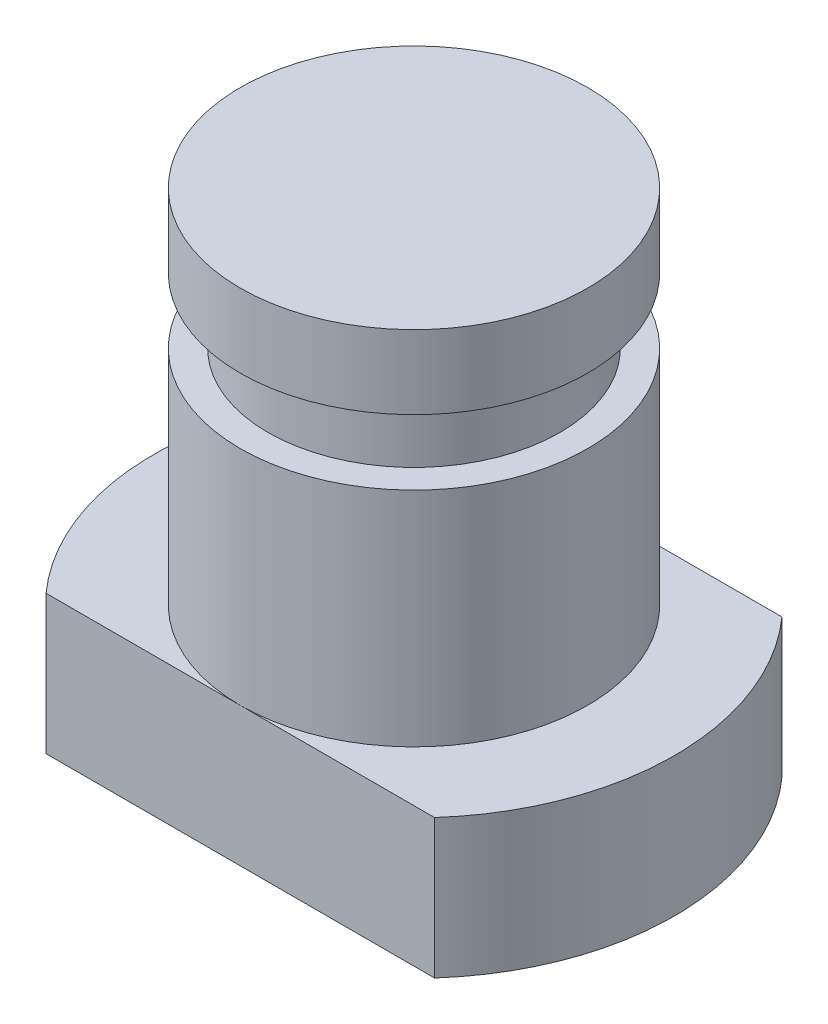
ISO-10303-21;
HEADER;
FILE_DESCRIPTION(('STEP AP214'),'2;1');
FILE_NAME('part.step','',(''),(''),'','','');
FILE_SCHEMA(('AUTOMOTIVE_DESIGN { 1 0 10303 214 1 1 1 1 }'));
ENDSEC;
DATA;
#1=APPLICATION_CONTEXT('core data for automotive mechanical design processes');
#2=APPLICATION_PROTOCOL_DEFINITION('international standard','automotive_design',2000,#1);
#3=PRODUCT_CONTEXT('',#1,'mechanical');
#4=PRODUCT('Part','Part','',(#3));
#5=PRODUCT_RELATED_PRODUCT_CATEGORY('part','',(#4));
#6=PRODUCT_DEFINITION_FORMATION('','',#4);
#7=PRODUCT_DEFINITION_CONTEXT('part definition',#1,'design');
#8=PRODUCT_DEFINITION('design','',#6,#7);
#9=PRODUCT_DEFINITION_SHAPE('','',#8);
#10=(LENGTH_UNIT() NAMED_UNIT(*) SI_UNIT(.MILLI.,.METRE.));
#11=(NAMED_UNIT(*) PLANE_ANGLE_UNIT() SI_UNIT($,.RADIAN.));
#12=(NAMED_UNIT(*) SI_UNIT($,.STERADIAN.) SOLID_ANGLE_UNIT());
#13=UNCERTAINTY_MEASURE_WITH_UNIT(LENGTH_MEASURE(1.E-05),#10,'distance_accuracy_value','');
#14=(GEOMETRIC_REPRESENTATION_CONTEXT(3) GLOBAL_UNCERTAINTY_ASSIGNED_CONTEXT((#13)) GLOBAL_UNIT_ASSIGNED_CONTEXT((#10,
#11,#12)) REPRESENTATION_CONTEXT('',''));
#15=CARTESIAN_POINT('',(0.,0.,0.));
#16=DIRECTION('',(0.,0.,1.));
#17=DIRECTION('',(1.,0.,0.));
#18=AXIS2_PLACEMENT_3D('',#15,#16,#17);
#19=CARTESIAN_POINT('',(0.,6.604,0.));
#20=DIRECTION('',(0.,-1.,0.));
#21=DIRECTION('',(0.,0.,-1.));
#22=AXIS2_PLACEMENT_3D('',#19,#20,#21);
#23=CYLINDRICAL_SURFACE('',#22,3.175);
#24=CARTESIAN_POINT('',(0.,0.,0.));
#25=DIRECTION('',(0.,1.,0.));
#26=DIRECTION('',(0.,0.,1.));
#27=AXIS2_PLACEMENT_3D('',#24,#25,#26);
#28=CIRCLE('',#27,3.175);
#29=CARTESIAN_POINT('',(0.,0.,3.175));
#30=VERTEX_POINT('',#29);
#31=CARTESIAN_POINT('',(0.,0.,-3.175));
#32=VERTEX_POINT('',#31);
#33=EDGE_CURVE('E82',#30,#32,#28,.T.);
#34=ORIENTED_EDGE('',*,*,#33,.T.);
#35=EDGE_CURVE('E95',#32,#30,#28,.T.);
#36=ORIENTED_EDGE('',*,*,#35,.T.);
#37=EDGE_LOOP('',(#34,#36));
#38=FACE_BOUND('',#37,.T.);
#39=CARTESIAN_POINT('',(0.,4.064,0.));
#40=DIRECTION('',(0.,1.,0.));
#41=DIRECTION('',(0.,0.,1.));
#42=AXIS2_PLACEMENT_3D('',#39,#40,#41);
#43=CIRCLE('',#42,3.175);
#44=CARTESIAN_POINT('',(0.,4.064,3.175));
#45=VERTEX_POINT('',#44);
#46=EDGE_CURVE('E160',#45,#45,#43,.T.);
#47=ORIENTED_EDGE('',*,*,#46,.F.);
#48=EDGE_LOOP('',(#47));
#49=FACE_BOUND('',#48,.T.);
#50=ADVANCED_FACE('F73',(#38,#49),#23,.T.);
#51=CARTESIAN_POINT('',(0.,0.,0.));
#52=DIRECTION('',(0.,-1.,0.));
#53=DIRECTION('',(0.,0.,-1.));
#54=AXIS2_PLACEMENT_3D('',#51,#52,#53);
#55=PLANE('',#54);
#56=ORIENTED_EDGE('',*,*,#33,.F.);
#57=DIRECTION('',(1.,0.,0.));
#58=VECTOR('',#57,1.);
#59=CARTESIAN_POINT('',(0.,0.,3.175));
#60=LINE('',#59,#58);
#61=CARTESIAN_POINT('',(3.54975791428092,0.,3.175));
#62=VERTEX_POINT('',#61);
#63=EDGE_CURVE('E178',#30,#62,#60,.T.);
#64=ORIENTED_EDGE('',*,*,#63,.T.);
#65=CARTESIAN_POINT('',(0.,0.,0.));
#66=DIRECTION('',(0.,-1.,0.));
#67=DIRECTION('',(0.,0.,-1.));
#68=AXIS2_PLACEMENT_3D('',#65,#66,#67);
#69=CIRCLE('',#68,4.7625);
#70=CARTESIAN_POINT('',(3.54975791428092,0.,-3.175));
#71=VERTEX_POINT('',#70);
#72=EDGE_CURVE('E177',#71,#62,#69,.T.);
#73=ORIENTED_EDGE('',*,*,#72,.F.);
#74=DIRECTION('',(1.,0.,0.));
#75=VECTOR('',#74,1.);
#76=CARTESIAN_POINT('',(0.,0.,-3.175));
#77=LINE('',#76,#75);
#78=EDGE_CURVE('E144',#32,#71,#77,.T.);
#79=ORIENTED_EDGE('',*,*,#78,.F.);
#80=EDGE_LOOP('',(#56,#64,#73,#79));
#81=FACE_BOUND('',#80,.T.);
#82=ADVANCED_FACE('F181',(#81),#55,.F.);
#83=CARTESIAN_POINT('',(0.,-2.54,3.175));
#84=DIRECTION('',(0.,0.,1.));
#85=DIRECTION('',(1.,0.,0.));
#86=AXIS2_PLACEMENT_3D('',#83,#84,#85);
#87=PLANE('',#86);
#88=CARTESIAN_POINT('',(-3.54975791428092,0.,3.175));
#89=VERTEX_POINT('',#88);
#90=EDGE_CURVE('E90',#89,#30,#60,.T.);
#91=ORIENTED_EDGE('',*,*,#90,.F.);
#92=DIRECTION('',(0.,1.,0.));
#93=VECTOR('',#92,1.);
#94=CARTESIAN_POINT('',(-3.54975791428092,-2.54,3.175));
#95=LINE('',#94,#93);
#96=CARTESIAN_POINT('',(-3.54975791428092,-2.54,3.175));
#97=VERTEX_POINT('',#96);
#98=EDGE_CURVE('E152',#97,#89,#95,.T.);
#99=ORIENTED_EDGE('',*,*,#98,.F.);
#100=DIRECTION('',(1.,0.,0.));
#101=VECTOR('',#100,1.);
#102=CARTESIAN_POINT('',(0.,-2.54,3.175));
#103=LINE('',#102,#101);
#104=CARTESIAN_POINT('',(3.54975791428092,-2.54,3.175));
#105=VERTEX_POINT('',#104);
#106=EDGE_CURVE('E131',#97,#105,#103,.T.);
#107=ORIENTED_EDGE('',*,*,#106,.T.);
#108=DIRECTION('',(0.,1.,0.));
#109=VECTOR('',#108,1.);
#110=CARTESIAN_POINT('',(3.54975791428092,-2.54,3.175));
#111=LINE('',#110,#109);
#112=EDGE_CURVE('E128',#105,#62,#111,.T.);
#113=ORIENTED_EDGE('',*,*,#112,.T.);
#114=ORIENTED_EDGE('',*,*,#63,.F.);
#115=EDGE_LOOP('',(#91,#99,#107,#113,#114));
#116=FACE_BOUND('',#115,.T.);
#117=ADVANCED_FACE('F183',(#116),#87,.T.);
#118=ORIENTED_EDGE('',*,*,#35,.F.);
#119=CARTESIAN_POINT('',(-3.54975791428092,0.,-3.175));
#120=VERTEX_POINT('',#119);
#121=EDGE_CURVE('E175',#120,#32,#77,.T.);
#122=ORIENTED_EDGE('',*,*,#121,.F.);
#123=CARTESIAN_POINT('',(0.,0.,0.));
#124=DIRECTION('',(0.,-1.,0.));
#125=DIRECTION('',(0.,0.,-1.));
#126=AXIS2_PLACEMENT_3D('',#123,#124,#125);
#127=CIRCLE('',#126,4.7625);
#128=EDGE_CURVE('E153',#89,#120,#127,.T.);
#129=ORIENTED_EDGE('',*,*,#128,.F.);
#130=ORIENTED_EDGE('',*,*,#90,.T.);
#131=EDGE_LOOP('',(#118,#122,#129,#130));
#132=FACE_BOUND('',#131,.T.);
#133=ADVANCED_FACE('F194',(#132),#55,.F.);
#134=CARTESIAN_POINT('',(0.,-2.54,0.));
#135=DIRECTION('',(0.,1.,0.));
#136=DIRECTION('',(0.,0.,1.));
#137=AXIS2_PLACEMENT_3D('',#134,#135,#136);
#138=CYLINDRICAL_SURFACE('',#137,4.7625);
#139=ORIENTED_EDGE('',*,*,#72,.T.);
#140=ORIENTED_EDGE('',*,*,#112,.F.);
#141=CARTESIAN_POINT('',(0.,-2.54,0.));
#142=DIRECTION('',(0.,-1.,0.));
#143=DIRECTION('',(0.,0.,-1.));
#144=AXIS2_PLACEMENT_3D('',#141,#142,#143);
#145=CIRCLE('',#144,4.7625);
#146=CARTESIAN_POINT('',(3.54975791428092,-2.54,-3.175));
#147=VERTEX_POINT('',#146);
#148=EDGE_CURVE('E121',#147,#105,#145,.T.);
#149=ORIENTED_EDGE('',*,*,#148,.F.);
#150=DIRECTION('',(0.,1.,0.));
#151=VECTOR('',#150,1.);
#152=CARTESIAN_POINT('',(3.54975791428092,-2.54,-3.175));
#153=LINE('',#152,#151);
#154=EDGE_CURVE('E126',#147,#71,#153,.T.);
#155=ORIENTED_EDGE('',*,*,#154,.T.);
#156=EDGE_LOOP('',(#139,#140,#149,#155));
#157=FACE_BOUND('',#156,.T.);
#158=ADVANCED_FACE('F124',(#157),#138,.T.);
#159=CARTESIAN_POINT('',(0.,-2.54,-3.175));
#160=DIRECTION('',(0.,0.,1.));
#161=DIRECTION('',(1.,0.,0.));
#162=AXIS2_PLACEMENT_3D('',#159,#160,#161);
#163=PLANE('',#162);
#164=ORIENTED_EDGE('',*,*,#121,.T.);
#165=ORIENTED_EDGE('',*,*,#78,.T.);
#166=ORIENTED_EDGE('',*,*,#154,.F.);
#167=DIRECTION('',(1.,0.,0.));
#168=VECTOR('',#167,1.);
#169=CARTESIAN_POINT('',(0.,-2.54,-3.175));
#170=LINE('',#169,#168);
#171=CARTESIAN_POINT('',(-3.54975791428092,-2.54,-3.175));
#172=VERTEX_POINT('',#171);
#173=EDGE_CURVE('E132',#172,#147,#170,.T.);
#174=ORIENTED_EDGE('',*,*,#173,.F.);
#175=DIRECTION('',(0.,1.,0.));
#176=VECTOR('',#175,1.);
#177=CARTESIAN_POINT('',(-3.54975791428092,-2.54,-3.175));
#178=LINE('',#177,#176);
#179=EDGE_CURVE('E158',#172,#120,#178,.T.);
#180=ORIENTED_EDGE('',*,*,#179,.T.);
#181=EDGE_LOOP('',(#164,#165,#166,#174,#180));
#182=FACE_BOUND('',#181,.T.);
#183=ADVANCED_FACE('F143',(#182),#163,.F.);
#184=CARTESIAN_POINT('',(0.,-2.54,0.));
#185=DIRECTION('',(0.,-1.,0.));
#186=DIRECTION('',(0.,0.,-1.));
#187=AXIS2_PLACEMENT_3D('',#184,#185,#186);
#188=PLANE('',#187);
#189=ORIENTED_EDGE('',*,*,#173,.T.);
#190=ORIENTED_EDGE('',*,*,#148,.T.);
#191=ORIENTED_EDGE('',*,*,#106,.F.);
#192=CARTESIAN_POINT('',(0.,-2.54,0.));
#193=DIRECTION('',(0.,-1.,0.));
#194=DIRECTION('',(0.,0.,-1.));
#195=AXIS2_PLACEMENT_3D('',#192,#193,#194);
#196=CIRCLE('',#195,4.7625);
#197=EDGE_CURVE('E137',#97,#172,#196,.T.);
#198=ORIENTED_EDGE('',*,*,#197,.T.);
#199=EDGE_LOOP('',(#189,#190,#191,#198));
#200=FACE_BOUND('',#199,.T.);
#201=ADVANCED_FACE('F135',(#200),#188,.T.);
#202=CARTESIAN_POINT('',(0.,-2.54,0.));
#203=DIRECTION('',(0.,1.,0.));
#204=DIRECTION('',(0.,0.,1.));
#205=AXIS2_PLACEMENT_3D('',#202,#203,#204);
#206=CYLINDRICAL_SURFACE('',#205,4.7625);
#207=ORIENTED_EDGE('',*,*,#128,.T.);
#208=ORIENTED_EDGE('',*,*,#179,.F.);
#209=ORIENTED_EDGE('',*,*,#197,.F.);
#210=ORIENTED_EDGE('',*,*,#98,.T.);
#211=EDGE_LOOP('',(#207,#208,#209,#210));
#212=FACE_BOUND('',#211,.T.);
#213=ADVANCED_FACE('F186',(#212),#206,.T.);
#214=CARTESIAN_POINT('',(0.,5.2578,0.));
#215=DIRECTION('',(0.,1.,0.));
#216=DIRECTION('',(0.,0.,1.));
#217=AXIS2_PLACEMENT_3D('',#214,#215,#216);
#218=PLANE('',#217);
#219=CARTESIAN_POINT('',(0.,5.2578,0.));
#220=DIRECTION('',(0.,1.,0.));
#221=DIRECTION('',(0.,0.,1.));
#222=AXIS2_PLACEMENT_3D('',#219,#220,#221);
#223=CIRCLE('',#222,2.667);
#224=CARTESIAN_POINT('',(0.,5.2578,2.667));
#225=VERTEX_POINT('',#224);
#226=EDGE_CURVE('E162',#225,#225,#223,.T.);
#227=ORIENTED_EDGE('',*,*,#226,.T.);
#228=EDGE_LOOP('',(#227));
#229=FACE_BOUND('',#228,.T.);
#230=CARTESIAN_POINT('',(0.,5.2578,0.));
#231=DIRECTION('',(0.,1.,0.));
#232=DIRECTION('',(0.,0.,1.));
#233=AXIS2_PLACEMENT_3D('',#230,#231,#232);
#234=CIRCLE('',#233,3.175);
#235=CARTESIAN_POINT('',(0.,5.2578,-3.175));
#236=VERTEX_POINT('',#235);
#237=EDGE_CURVE('E77',#236,#236,#234,.T.);
#238=ORIENTED_EDGE('',*,*,#237,.F.);
#239=EDGE_LOOP('',(#238));
#240=FACE_BOUND('',#239,.T.);
#241=ADVANCED_FACE('F207',(#229,#240),#218,.F.);
#242=CARTESIAN_POINT('',(0.,4.064,0.));
#243=DIRECTION('',(0.,1.,0.));
#244=DIRECTION('',(0.,0.,1.));
#245=AXIS2_PLACEMENT_3D('',#242,#243,#244);
#246=PLANE('',#245);
#247=CARTESIAN_POINT('',(0.,4.064,0.));
#248=DIRECTION('',(0.,1.,0.));
#249=DIRECTION('',(0.,0.,1.));
#250=AXIS2_PLACEMENT_3D('',#247,#248,#249);
#251=CIRCLE('',#250,2.667);
#252=CARTESIAN_POINT('',(0.,4.064,2.667));
#253=VERTEX_POINT('',#252);
#254=EDGE_CURVE('E167',#253,#253,#251,.T.);
#255=ORIENTED_EDGE('',*,*,#254,.F.);
#256=EDGE_LOOP('',(#255));
#257=FACE_BOUND('',#256,.T.);
#258=ORIENTED_EDGE('',*,*,#46,.T.);
#259=EDGE_LOOP('',(#258));
#260=FACE_BOUND('',#259,.T.);
#261=ADVANCED_FACE('F209',(#257,#260),#246,.T.);
#262=CARTESIAN_POINT('',(0.,5.2578,0.));
#263=DIRECTION('',(0.,-1.,0.));
#264=DIRECTION('',(0.,0.,-1.));
#265=AXIS2_PLACEMENT_3D('',#262,#263,#264);
#266=CYLINDRICAL_SURFACE('',#265,2.667);
#267=ORIENTED_EDGE('',*,*,#226,.F.);
#268=EDGE_LOOP('',(#267));
#269=FACE_BOUND('',#268,.T.);
#270=ORIENTED_EDGE('',*,*,#254,.T.);
#271=EDGE_LOOP('',(#270));
#272=FACE_BOUND('',#271,.T.);
#273=ADVANCED_FACE('F201',(#269,#272),#266,.T.);
#274=CARTESIAN_POINT('',(0.,6.604,0.));
#275=DIRECTION('',(0.,1.,0.));
#276=DIRECTION('',(0.,0.,1.));
#277=AXIS2_PLACEMENT_3D('',#274,#275,#276);
#278=PLANE('',#277);
#279=CARTESIAN_POINT('',(0.,6.604,0.));
#280=DIRECTION('',(0.,1.,0.));
#281=DIRECTION('',(0.,0.,1.));
#282=AXIS2_PLACEMENT_3D('',#279,#280,#281);
#283=CIRCLE('',#282,3.175);
#284=CARTESIAN_POINT('',(0.,6.604,-3.175));
#285=VERTEX_POINT('',#284);
#286=EDGE_CURVE('E15',#285,#285,#283,.T.);
#287=ORIENTED_EDGE('',*,*,#286,.T.);
#288=EDGE_LOOP('',(#287));
#289=FACE_BOUND('',#288,.T.);
#290=ADVANCED_FACE('F196',(#289),#278,.T.);
#291=CARTESIAN_POINT('',(0.,5.2578,-3.175));
#292=CARTESIAN_POINT('',(0.,5.27182291666667,-3.175));
#293=CARTESIAN_POINT('',(0.,5.28584583333333,-3.175));
#294=CARTESIAN_POINT('',(0.,5.31389166666667,-3.175));
#295=CARTESIAN_POINT('',(0.,5.32791458333333,-3.175));
#296=CARTESIAN_POINT('',(0.,5.35596041666667,-3.175));
#297=CARTESIAN_POINT('',(0.,5.36998333333333,-3.175));
#298=CARTESIAN_POINT('',(0.,5.39802916666667,-3.175));
#299=CARTESIAN_POINT('',(0.,5.41205208333333,-3.175));
#300=CARTESIAN_POINT('',(0.,5.44009791666667,-3.175));
#301=CARTESIAN_POINT('',(0.,5.45412083333333,-3.175));
#302=CARTESIAN_POINT('',(0.,5.48216666666667,-3.175));
#303=CARTESIAN_POINT('',(0.,5.49618958333333,-3.175));
#304=CARTESIAN_POINT('',(0.,5.52423541666667,-3.175));
#305=CARTESIAN_POINT('',(0.,5.53825833333333,-3.175));
#306=CARTESIAN_POINT('',(0.,5.56630416666667,-3.175));
#307=CARTESIAN_POINT('',(0.,5.58032708333333,-3.175));
#308=CARTESIAN_POINT('',(0.,5.60837291666667,-3.175));
#309=CARTESIAN_POINT('',(0.,5.62239583333333,-3.175));
#310=CARTESIAN_POINT('',(0.,5.65044166666667,-3.175));
#311=CARTESIAN_POINT('',(0.,5.66446458333333,-3.175));
#312=CARTESIAN_POINT('',(0.,5.69251041666667,-3.175));
#313=CARTESIAN_POINT('',(0.,5.70653333333333,-3.175));
#314=CARTESIAN_POINT('',(0.,5.73457916666667,-3.175));
#315=CARTESIAN_POINT('',(0.,5.74860208333333,-3.175));
#316=CARTESIAN_POINT('',(0.,5.77664791666667,-3.175));
#317=CARTESIAN_POINT('',(0.,5.79067083333333,-3.175));
#318=CARTESIAN_POINT('',(0.,5.81871666666667,-3.175));
#319=CARTESIAN_POINT('',(0.,5.83273958333333,-3.175));
#320=CARTESIAN_POINT('',(0.,5.86078541666667,-3.175));
#321=CARTESIAN_POINT('',(0.,5.87480833333333,-3.175));
#322=CARTESIAN_POINT('',(0.,5.90285416666667,-3.175));
#323=CARTESIAN_POINT('',(0.,5.91687708333333,-3.175));
#324=CARTESIAN_POINT('',(0.,5.94492291666667,-3.175));
#325=CARTESIAN_POINT('',(0.,5.95894583333333,-3.175));
#326=CARTESIAN_POINT('',(0.,5.98699166666667,-3.175));
#327=CARTESIAN_POINT('',(0.,6.00101458333333,-3.175));
#328=CARTESIAN_POINT('',(0.,6.02906041666667,-3.175));
#329=CARTESIAN_POINT('',(0.,6.04308333333333,-3.175));
#330=CARTESIAN_POINT('',(0.,6.07112916666667,-3.175));
#331=CARTESIAN_POINT('',(0.,6.08515208333333,-3.175));
#332=CARTESIAN_POINT('',(0.,6.11319791666667,-3.175));
#333=CARTESIAN_POINT('',(0.,6.12722083333333,-3.175));
#334=CARTESIAN_POINT('',(0.,6.15526666666667,-3.175));
#335=CARTESIAN_POINT('',(0.,6.16928958333333,-3.175));
#336=CARTESIAN_POINT('',(0.,6.19733541666667,-3.175));
#337=CARTESIAN_POINT('',(0.,6.21135833333333,-3.175));
#338=CARTESIAN_POINT('',(0.,6.23940416666667,-3.175));
#339=CARTESIAN_POINT('',(0.,6.25342708333333,-3.175));
#340=CARTESIAN_POINT('',(0.,6.28147291666667,-3.175));
#341=CARTESIAN_POINT('',(0.,6.29549583333333,-3.175));
#342=CARTESIAN_POINT('',(0.,6.32354166666667,-3.175));
#343=CARTESIAN_POINT('',(0.,6.33756458333333,-3.175));
#344=CARTESIAN_POINT('',(0.,6.36561041666667,-3.175));
#345=CARTESIAN_POINT('',(0.,6.37963333333333,-3.175));
#346=CARTESIAN_POINT('',(0.,6.40767916666667,-3.175));
#347=CARTESIAN_POINT('',(0.,6.42170208333333,-3.175));
#348=CARTESIAN_POINT('',(0.,6.44974791666667,-3.175));
#349=CARTESIAN_POINT('',(0.,6.46377083333333,-3.175));
#350=CARTESIAN_POINT('',(0.,6.49181666666667,-3.175));
#351=CARTESIAN_POINT('',(0.,6.50583958333333,-3.175));
#352=CARTESIAN_POINT('',(0.,6.53388541666667,-3.175));
#353=CARTESIAN_POINT('',(0.,6.54790833333333,-3.175));
#354=CARTESIAN_POINT('',(0.,6.57595416666667,-3.175));
#355=CARTESIAN_POINT('',(0.,6.58997708333333,-3.175));
#356=CARTESIAN_POINT('',(0.,6.604,-3.175));
#357=B_SPLINE_CURVE_WITH_KNOTS('',3,(#291,#292,#293,#294,#295,#296,#297,#298,#299,#300,#301,
#302,#303,#304,#305,#306,#307,#308,#309,#310,#311,#312,#313,#314,#315,#316,#317,#318,#319,#320,
#321,#322,#323,#324,#325,#326,#327,#328,#329,#330,#331,#332,#333,#334,#335,#336,#337,#338,#339,
#340,#341,#342,#343,#344,#345,#346,#347,#348,#349,#350,#351,#352,#353,#354,#355,#356),
.UNSPECIFIED.,.F.,.F.,(4,2,2,2,2,2,2,2,2,2,2,2,2,2,2,2,2,2,2,2,2,2,2,2,2,2,2,2,2,2,2,2,4),(0.,
0.0420687499999997,0.0841375000000004,0.12620625,0.168275,0.21034375,0.2524125,0.29448125,
0.336550000000001,0.37861875,0.4206875,0.46275625,0.504825,0.54689375,0.5889625,0.63103125,
0.6731,0.71516875,0.7572375,0.79930625,0.841375,0.88344375,0.925512500000001,0.96758125,1.00965,
1.05171875,1.0937875,1.13585625,1.177925,1.21999375,1.2620625,1.30413125,1.3462),.UNSPECIFIED.);
#358=EDGE_CURVE('BSEAM75',#236,#285,#357,.T.);
#359=ORIENTED_EDGE('',*,*,#237,.T.);
#360=ORIENTED_EDGE('',*,*,#286,.F.);
#361=ORIENTED_EDGE('',*,*,#358,.T.);
#362=ORIENTED_EDGE('',*,*,#358,.F.);
#363=EDGE_LOOP('',(#359,#361,#360,#362));
#364=FACE_BOUND('',#363,.T.);
#365=ADVANCED_FACE('F75',(#364),#23,.T.);
#366=CLOSED_SHELL('',(#50,#82,#117,#133,#158,#183,#201,#213,#241,#261,#273,#290,#365));
#367=MANIFOLD_SOLID_BREP('B2',#366);
#368=ADVANCED_BREP_SHAPE_REPRESENTATION('',(#18,#367),#14);
#369=SHAPE_DEFINITION_REPRESENTATION(#9,#368);
ENDSEC;
END-ISO-10303-21;
